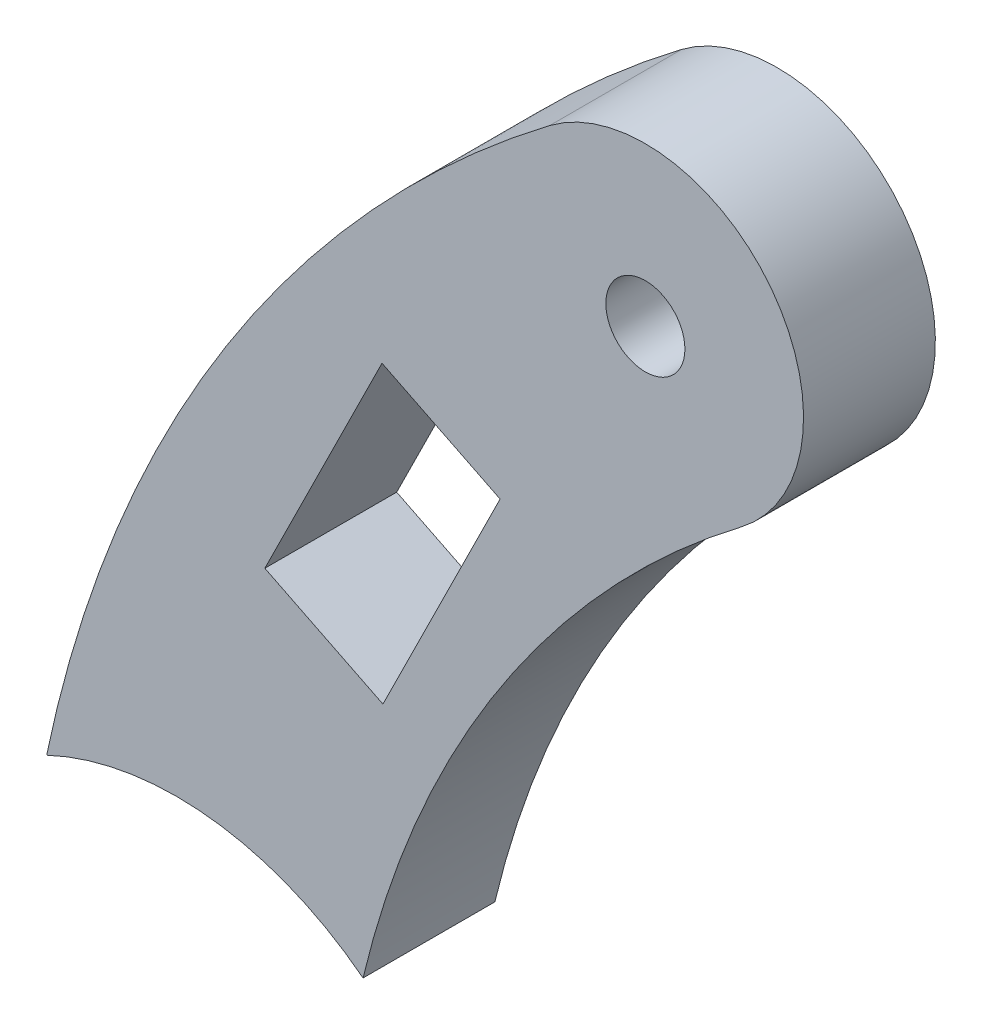
ISO-10303-21;
HEADER;
FILE_DESCRIPTION(('STEP AP214'),'2;1');
FILE_NAME('part.step','',(''),(''),'','','');
FILE_SCHEMA(('AUTOMOTIVE_DESIGN { 1 0 10303 214 1 1 1 1 }'));
ENDSEC;
DATA;
#1=APPLICATION_CONTEXT('core data for automotive mechanical design processes');
#2=APPLICATION_PROTOCOL_DEFINITION('international standard','automotive_design',2000,#1);
#3=PRODUCT_CONTEXT('',#1,'mechanical');
#4=PRODUCT('Part','Part','',(#3));
#5=PRODUCT_RELATED_PRODUCT_CATEGORY('part','',(#4));
#6=PRODUCT_DEFINITION_FORMATION('','',#4);
#7=PRODUCT_DEFINITION_CONTEXT('part definition',#1,'design');
#8=PRODUCT_DEFINITION('design','',#6,#7);
#9=PRODUCT_DEFINITION_SHAPE('','',#8);
#10=(LENGTH_UNIT() NAMED_UNIT(*) SI_UNIT(.MILLI.,.METRE.));
#11=(NAMED_UNIT(*) PLANE_ANGLE_UNIT() SI_UNIT($,.RADIAN.));
#12=(NAMED_UNIT(*) SI_UNIT($,.STERADIAN.) SOLID_ANGLE_UNIT());
#13=UNCERTAINTY_MEASURE_WITH_UNIT(LENGTH_MEASURE(1.E-05),#10,'distance_accuracy_value','');
#14=(GEOMETRIC_REPRESENTATION_CONTEXT(3) GLOBAL_UNCERTAINTY_ASSIGNED_CONTEXT((#13)) GLOBAL_UNIT_ASSIGNED_CONTEXT((#10,
#11,#12)) REPRESENTATION_CONTEXT('',''));
#15=CARTESIAN_POINT('',(0.,0.,0.));
#16=DIRECTION('',(0.,0.,1.));
#17=DIRECTION('',(1.,0.,0.));
#18=AXIS2_PLACEMENT_3D('',#15,#16,#17);
#19=CARTESIAN_POINT('',(-13.6111111111111,17.9161283295523,5.));
#20=DIRECTION('',(0.,0.,1.));
#21=DIRECTION('',(1.,0.,0.));
#22=AXIS2_PLACEMENT_3D('',#19,#20,#21);
#23=PLANE('',#22);
#24=CARTESIAN_POINT('',(-27.2222222222222,35.8322566591047,5.));
#25=DIRECTION('',(0.,0.,1.));
#26=DIRECTION('',(1.,0.,0.));
#27=AXIS2_PLACEMENT_3D('',#24,#25,#26);
#28=CIRCLE('',#27,1.5);
#29=CARTESIAN_POINT('',(-25.7222222222222,35.8322566591047,5.));
#30=VERTEX_POINT('',#29);
#31=EDGE_CURVE('E133',#30,#30,#28,.T.);
#32=ORIENTED_EDGE('',*,*,#31,.F.);
#33=EDGE_LOOP('',(#32));
#34=FACE_BOUND('',#33,.T.);
#35=CARTESIAN_POINT('',(-27.2222222222222,35.8322566591047,5.));
#36=DIRECTION('',(0.,0.,1.));
#37=DIRECTION('',(1.,0.,0.));
#38=AXIS2_PLACEMENT_3D('',#35,#36,#37);
#39=CIRCLE('',#38,6.00000000000001);
#40=CARTESIAN_POINT('',(-23.5925925925926,31.0546224378907,5.));
#41=VERTEX_POINT('',#40);
#42=CARTESIAN_POINT('',(-30.8518518518518,40.6098908803187,5.));
#43=VERTEX_POINT('',#42);
#44=EDGE_CURVE('E139',#41,#43,#39,.T.);
#45=ORIENTED_EDGE('',*,*,#44,.T.);
#46=CARTESIAN_POINT('',(0.,0.,5.));
#47=DIRECTION('',(0.,0.,1.));
#48=DIRECTION('',(1.,0.,0.));
#49=AXIS2_PLACEMENT_3D('',#46,#47,#48);
#50=CIRCLE('',#49,51.);
#51=CARTESIAN_POINT('',(-49.9305555555556,10.3893994972559,5.));
#52=VERTEX_POINT('',#51);
#53=EDGE_CURVE('E142',#43,#52,#50,.T.);
#54=ORIENTED_EDGE('',*,*,#53,.T.);
#55=CARTESIAN_POINT('',(-45.,-2.65412691824451E-13,5.));
#56=DIRECTION('',(0.,0.,-1.));
#57=DIRECTION('',(-1.,0.,0.));
#58=AXIS2_PLACEMENT_3D('',#55,#56,#57);
#59=CIRCLE('',#58,11.5000000000002);
#60=CARTESIAN_POINT('',(-37.9305555555556,9.0704440490482,5.));
#61=VERTEX_POINT('',#60);
#62=EDGE_CURVE('E145',#52,#61,#59,.T.);
#63=ORIENTED_EDGE('',*,*,#62,.T.);
#64=CARTESIAN_POINT('',(0.,0.,5.));
#65=DIRECTION('',(0.,0.,-1.));
#66=DIRECTION('',(1.,0.,0.));
#67=AXIS2_PLACEMENT_3D('',#64,#65,#66);
#68=CIRCLE('',#67,39.);
#69=EDGE_CURVE('E147',#61,#41,#68,.T.);
#70=ORIENTED_EDGE('',*,*,#69,.T.);
#71=EDGE_LOOP('',(#45,#54,#63,#70));
#72=FACE_BOUND('',#71,.T.);
#73=DIRECTION('',(0.895806416477616,-0.444444444444445,0.));
#74=VECTOR('',#73,1.);
#75=CARTESIAN_POINT('',(-41.6549983662092,20.6666666666667,5.));
#76=LINE('',#75,#74);
#77=CARTESIAN_POINT('',(-41.6549983662092,20.6666666666667,5.));
#78=VERTEX_POINT('',#77);
#79=CARTESIAN_POINT('',(-37.1759662838211,18.4444444444444,5.));
#80=VERTEX_POINT('',#79);
#81=EDGE_CURVE('E105',#78,#80,#76,.T.);
#82=ORIENTED_EDGE('',*,*,#81,.F.);
#83=DIRECTION('',(-0.444444444444446,-0.895806416477616,0.));
#84=VECTOR('',#83,1.);
#85=CARTESIAN_POINT('',(-37.2105539217647,29.6247308314428,5.));
#86=LINE('',#85,#84);
#87=CARTESIAN_POINT('',(-37.2105539217647,29.6247308314428,5.));
#88=VERTEX_POINT('',#87);
#89=EDGE_CURVE('E97',#88,#78,#86,.T.);
#90=ORIENTED_EDGE('',*,*,#89,.F.);
#91=DIRECTION('',(-0.895806416477616,0.444444444444446,0.));
#92=VECTOR('',#91,1.);
#93=CARTESIAN_POINT('',(-32.7315218393766,27.4025086092206,5.));
#94=LINE('',#93,#92);
#95=CARTESIAN_POINT('',(-32.7315218393766,27.4025086092206,5.));
#96=VERTEX_POINT('',#95);
#97=EDGE_CURVE('E119',#96,#88,#94,.T.);
#98=ORIENTED_EDGE('',*,*,#97,.F.);
#99=DIRECTION('',(0.444444444444444,0.895806416477617,0.));
#100=VECTOR('',#99,1.);
#101=CARTESIAN_POINT('',(-37.1759662838211,18.4444444444444,5.));
#102=LINE('',#101,#100);
#103=EDGE_CURVE('E117',#80,#96,#102,.T.);
#104=ORIENTED_EDGE('',*,*,#103,.F.);
#105=EDGE_LOOP('',(#82,#90,#98,#104));
#106=FACE_BOUND('',#105,.T.);
#107=ADVANCED_FACE('F32',(#34,#72,#106),#23,.T.);
#108=CARTESIAN_POINT('',(-13.6111111111111,17.9161283295523,0.));
#109=DIRECTION('',(0.,0.,1.));
#110=DIRECTION('',(1.,0.,0.));
#111=AXIS2_PLACEMENT_3D('',#108,#109,#110);
#112=PLANE('',#111);
#113=CARTESIAN_POINT('',(-27.2222222222222,35.8322566591047,0.));
#114=DIRECTION('',(0.,0.,1.));
#115=DIRECTION('',(1.,0.,0.));
#116=AXIS2_PLACEMENT_3D('',#113,#114,#115);
#117=CIRCLE('',#116,1.5);
#118=CARTESIAN_POINT('',(-25.7222222222222,35.8322566591047,0.));
#119=VERTEX_POINT('',#118);
#120=EDGE_CURVE('E113',#119,#119,#117,.T.);
#121=ORIENTED_EDGE('',*,*,#120,.T.);
#122=EDGE_LOOP('',(#121));
#123=FACE_BOUND('',#122,.T.);
#124=CARTESIAN_POINT('',(-27.2222222222222,35.8322566591047,0.));
#125=DIRECTION('',(0.,0.,1.));
#126=DIRECTION('',(1.,0.,0.));
#127=AXIS2_PLACEMENT_3D('',#124,#125,#126);
#128=CIRCLE('',#127,6.00000000000001);
#129=CARTESIAN_POINT('',(-23.5925925925926,31.0546224378907,0.));
#130=VERTEX_POINT('',#129);
#131=CARTESIAN_POINT('',(-30.8518518518518,40.6098908803187,0.));
#132=VERTEX_POINT('',#131);
#133=EDGE_CURVE('E136',#130,#132,#128,.T.);
#134=ORIENTED_EDGE('',*,*,#133,.F.);
#135=CARTESIAN_POINT('',(0.,0.,0.));
#136=DIRECTION('',(0.,0.,-1.));
#137=DIRECTION('',(1.,0.,0.));
#138=AXIS2_PLACEMENT_3D('',#135,#136,#137);
#139=CIRCLE('',#138,39.);
#140=CARTESIAN_POINT('',(-37.9305555555556,9.0704440490482,0.));
#141=VERTEX_POINT('',#140);
#142=EDGE_CURVE('E143',#141,#130,#139,.T.);
#143=ORIENTED_EDGE('',*,*,#142,.F.);
#144=CARTESIAN_POINT('',(-45.,-2.65412691824451E-13,0.));
#145=DIRECTION('',(0.,0.,-1.));
#146=DIRECTION('',(-1.,0.,0.));
#147=AXIS2_PLACEMENT_3D('',#144,#145,#146);
#148=CIRCLE('',#147,11.5000000000002);
#149=CARTESIAN_POINT('',(-49.9305555555556,10.3893994972559,0.));
#150=VERTEX_POINT('',#149);
#151=EDGE_CURVE('E154',#150,#141,#148,.T.);
#152=ORIENTED_EDGE('',*,*,#151,.F.);
#153=CARTESIAN_POINT('',(0.,0.,0.));
#154=DIRECTION('',(0.,0.,1.));
#155=DIRECTION('',(1.,0.,0.));
#156=AXIS2_PLACEMENT_3D('',#153,#154,#155);
#157=CIRCLE('',#156,51.);
#158=EDGE_CURVE('E152',#132,#150,#157,.T.);
#159=ORIENTED_EDGE('',*,*,#158,.F.);
#160=EDGE_LOOP('',(#134,#143,#152,#159));
#161=FACE_BOUND('',#160,.T.);
#162=DIRECTION('',(-0.444444444444446,-0.895806416477616,0.));
#163=VECTOR('',#162,1.);
#164=CARTESIAN_POINT('',(-37.2105539217647,29.6247308314428,0.));
#165=LINE('',#164,#163);
#166=CARTESIAN_POINT('',(-37.2105539217647,29.6247308314428,0.));
#167=VERTEX_POINT('',#166);
#168=CARTESIAN_POINT('',(-41.6549983662092,20.6666666666667,0.));
#169=VERTEX_POINT('',#168);
#170=EDGE_CURVE('E55',#167,#169,#165,.T.);
#171=ORIENTED_EDGE('',*,*,#170,.T.);
#172=DIRECTION('',(0.895806416477616,-0.444444444444445,0.));
#173=VECTOR('',#172,1.);
#174=CARTESIAN_POINT('',(-41.6549983662092,20.6666666666667,0.));
#175=LINE('',#174,#173);
#176=CARTESIAN_POINT('',(-37.1759662838211,18.4444444444444,0.));
#177=VERTEX_POINT('',#176);
#178=EDGE_CURVE('E112',#169,#177,#175,.T.);
#179=ORIENTED_EDGE('',*,*,#178,.T.);
#180=DIRECTION('',(0.444444444444444,0.895806416477617,0.));
#181=VECTOR('',#180,1.);
#182=CARTESIAN_POINT('',(-37.1759662838211,18.4444444444444,0.));
#183=LINE('',#182,#181);
#184=CARTESIAN_POINT('',(-32.7315218393766,27.4025086092206,0.));
#185=VERTEX_POINT('',#184);
#186=EDGE_CURVE('E125',#177,#185,#183,.T.);
#187=ORIENTED_EDGE('',*,*,#186,.T.);
#188=DIRECTION('',(-0.895806416477616,0.444444444444446,0.));
#189=VECTOR('',#188,1.);
#190=CARTESIAN_POINT('',(-32.7315218393766,27.4025086092206,0.));
#191=LINE('',#190,#189);
#192=EDGE_CURVE('E106',#185,#167,#191,.T.);
#193=ORIENTED_EDGE('',*,*,#192,.T.);
#194=EDGE_LOOP('',(#171,#179,#187,#193));
#195=FACE_BOUND('',#194,.T.);
#196=ADVANCED_FACE('F172',(#123,#161,#195),#112,.F.);
#197=CARTESIAN_POINT('',(-27.2222222222222,35.8322566591047,5.));
#198=DIRECTION('',(0.,0.,-1.));
#199=DIRECTION('',(-1.,0.,0.));
#200=AXIS2_PLACEMENT_3D('',#197,#198,#199);
#201=CYLINDRICAL_SURFACE('',#200,6.00000000000001);
#202=ORIENTED_EDGE('',*,*,#133,.T.);
#203=DIRECTION('',(0.,0.,-1.));
#204=VECTOR('',#203,1.);
#205=CARTESIAN_POINT('',(-30.8518518518518,40.6098908803187,5.));
#206=LINE('',#205,#204);
#207=EDGE_CURVE('E11',#43,#132,#206,.T.);
#208=ORIENTED_EDGE('',*,*,#207,.F.);
#209=ORIENTED_EDGE('',*,*,#44,.F.);
#210=DIRECTION('',(0.,0.,-1.));
#211=VECTOR('',#210,1.);
#212=CARTESIAN_POINT('',(-23.5925925925926,31.0546224378907,5.));
#213=LINE('',#212,#211);
#214=EDGE_CURVE('E149',#41,#130,#213,.T.);
#215=ORIENTED_EDGE('',*,*,#214,.T.);
#216=EDGE_LOOP('',(#202,#208,#209,#215));
#217=FACE_BOUND('',#216,.T.);
#218=ADVANCED_FACE('F34',(#217),#201,.T.);
#219=CARTESIAN_POINT('',(0.,0.,5.));
#220=DIRECTION('',(0.,0.,-1.));
#221=DIRECTION('',(-1.,0.,0.));
#222=AXIS2_PLACEMENT_3D('',#219,#220,#221);
#223=CYLINDRICAL_SURFACE('',#222,51.);
#224=ORIENTED_EDGE('',*,*,#158,.T.);
#225=DIRECTION('',(0.,0.,-1.));
#226=VECTOR('',#225,1.);
#227=CARTESIAN_POINT('',(-49.9305555555556,10.3893994972559,5.));
#228=LINE('',#227,#226);
#229=EDGE_CURVE('E40',#52,#150,#228,.T.);
#230=ORIENTED_EDGE('',*,*,#229,.F.);
#231=ORIENTED_EDGE('',*,*,#53,.F.);
#232=ORIENTED_EDGE('',*,*,#207,.T.);
#233=EDGE_LOOP('',(#224,#230,#231,#232));
#234=FACE_BOUND('',#233,.T.);
#235=ADVANCED_FACE('F182',(#234),#223,.T.);
#236=CARTESIAN_POINT('',(-45.,-2.65412691824451E-13,5.));
#237=DIRECTION('',(0.,0.,-1.));
#238=DIRECTION('',(-1.,0.,0.));
#239=AXIS2_PLACEMENT_3D('',#236,#237,#238);
#240=CYLINDRICAL_SURFACE('',#239,11.5000000000002);
#241=ORIENTED_EDGE('',*,*,#151,.T.);
#242=DIRECTION('',(0.,0.,-1.));
#243=VECTOR('',#242,1.);
#244=CARTESIAN_POINT('',(-37.9305555555556,9.0704440490482,5.));
#245=LINE('',#244,#243);
#246=EDGE_CURVE('E159',#61,#141,#245,.T.);
#247=ORIENTED_EDGE('',*,*,#246,.F.);
#248=ORIENTED_EDGE('',*,*,#62,.F.);
#249=ORIENTED_EDGE('',*,*,#229,.T.);
#250=EDGE_LOOP('',(#241,#247,#248,#249));
#251=FACE_BOUND('',#250,.T.);
#252=ADVANCED_FACE('F166',(#251),#240,.F.);
#253=CARTESIAN_POINT('',(0.,0.,5.));
#254=DIRECTION('',(0.,0.,-1.));
#255=DIRECTION('',(-1.,0.,0.));
#256=AXIS2_PLACEMENT_3D('',#253,#254,#255);
#257=CYLINDRICAL_SURFACE('',#256,39.);
#258=ORIENTED_EDGE('',*,*,#142,.T.);
#259=ORIENTED_EDGE('',*,*,#214,.F.);
#260=ORIENTED_EDGE('',*,*,#69,.F.);
#261=ORIENTED_EDGE('',*,*,#246,.T.);
#262=EDGE_LOOP('',(#258,#259,#260,#261));
#263=FACE_BOUND('',#262,.T.);
#264=ADVANCED_FACE('F176',(#263),#257,.F.);
#265=CARTESIAN_POINT('',(-27.2222222222222,35.8322566591047,5.));
#266=DIRECTION('',(0.,0.,-1.));
#267=DIRECTION('',(-1.,0.,0.));
#268=AXIS2_PLACEMENT_3D('',#265,#266,#267);
#269=CYLINDRICAL_SURFACE('',#268,1.5);
#270=ORIENTED_EDGE('',*,*,#31,.T.);
#271=EDGE_LOOP('',(#270));
#272=FACE_BOUND('',#271,.T.);
#273=ORIENTED_EDGE('',*,*,#120,.F.);
#274=EDGE_LOOP('',(#273));
#275=FACE_BOUND('',#274,.T.);
#276=ADVANCED_FACE('F199',(#272,#275),#269,.F.);
#277=CARTESIAN_POINT('',(-37.2105539217647,29.6247308314428,5.));
#278=DIRECTION('',(0.895806416477616,-0.444444444444446,0.));
#279=DIRECTION('',(0.444444444444446,0.895806416477616,0.));
#280=AXIS2_PLACEMENT_3D('',#277,#278,#279);
#281=PLANE('',#280);
#282=ORIENTED_EDGE('',*,*,#170,.F.);
#283=DIRECTION('',(0.,0.,-1.));
#284=VECTOR('',#283,1.);
#285=CARTESIAN_POINT('',(-37.2105539217647,29.6247308314428,5.));
#286=LINE('',#285,#284);
#287=EDGE_CURVE('E101',#88,#167,#286,.T.);
#288=ORIENTED_EDGE('',*,*,#287,.F.);
#289=ORIENTED_EDGE('',*,*,#89,.T.);
#290=DIRECTION('',(0.,0.,-1.));
#291=VECTOR('',#290,1.);
#292=CARTESIAN_POINT('',(-41.6549983662092,20.6666666666667,5.));
#293=LINE('',#292,#291);
#294=EDGE_CURVE('E100',#78,#169,#293,.T.);
#295=ORIENTED_EDGE('',*,*,#294,.T.);
#296=EDGE_LOOP('',(#282,#288,#289,#295));
#297=FACE_BOUND('',#296,.T.);
#298=ADVANCED_FACE('F99',(#297),#281,.T.);
#299=CARTESIAN_POINT('',(-41.6549983662092,20.6666666666667,5.));
#300=DIRECTION('',(0.444444444444445,0.895806416477616,0.));
#301=DIRECTION('',(-0.895806416477616,0.444444444444445,0.));
#302=AXIS2_PLACEMENT_3D('',#299,#300,#301);
#303=PLANE('',#302);
#304=ORIENTED_EDGE('',*,*,#178,.F.);
#305=ORIENTED_EDGE('',*,*,#294,.F.);
#306=ORIENTED_EDGE('',*,*,#81,.T.);
#307=DIRECTION('',(0.,0.,-1.));
#308=VECTOR('',#307,1.);
#309=CARTESIAN_POINT('',(-37.1759662838211,18.4444444444444,5.));
#310=LINE('',#309,#308);
#311=EDGE_CURVE('E114',#80,#177,#310,.T.);
#312=ORIENTED_EDGE('',*,*,#311,.T.);
#313=EDGE_LOOP('',(#304,#305,#306,#312));
#314=FACE_BOUND('',#313,.T.);
#315=ADVANCED_FACE('F109',(#314),#303,.T.);
#316=CARTESIAN_POINT('',(-37.1759662838211,18.4444444444444,5.));
#317=DIRECTION('',(-0.895806416477617,0.444444444444444,0.));
#318=DIRECTION('',(-0.444444444444444,-0.895806416477617,0.));
#319=AXIS2_PLACEMENT_3D('',#316,#317,#318);
#320=PLANE('',#319);
#321=ORIENTED_EDGE('',*,*,#186,.F.);
#322=ORIENTED_EDGE('',*,*,#311,.F.);
#323=ORIENTED_EDGE('',*,*,#103,.T.);
#324=DIRECTION('',(0.,0.,-1.));
#325=VECTOR('',#324,1.);
#326=CARTESIAN_POINT('',(-32.7315218393766,27.4025086092206,5.));
#327=LINE('',#326,#325);
#328=EDGE_CURVE('E47',#96,#185,#327,.T.);
#329=ORIENTED_EDGE('',*,*,#328,.T.);
#330=EDGE_LOOP('',(#321,#322,#323,#329));
#331=FACE_BOUND('',#330,.T.);
#332=ADVANCED_FACE('F215',(#331),#320,.T.);
#333=CARTESIAN_POINT('',(-32.7315218393766,27.4025086092206,5.));
#334=DIRECTION('',(-0.444444444444446,-0.895806416477616,0.));
#335=DIRECTION('',(0.895806416477616,-0.444444444444446,0.));
#336=AXIS2_PLACEMENT_3D('',#333,#334,#335);
#337=PLANE('',#336);
#338=ORIENTED_EDGE('',*,*,#192,.F.);
#339=ORIENTED_EDGE('',*,*,#328,.F.);
#340=ORIENTED_EDGE('',*,*,#97,.T.);
#341=ORIENTED_EDGE('',*,*,#287,.T.);
#342=EDGE_LOOP('',(#338,#339,#340,#341));
#343=FACE_BOUND('',#342,.T.);
#344=ADVANCED_FACE('F220',(#343),#337,.T.);
#345=CLOSED_SHELL('',(#107,#196,#218,#235,#252,#264,#276,#298,#315,#332,#344));
#346=MANIFOLD_SOLID_BREP('B2',#345);
#347=ADVANCED_BREP_SHAPE_REPRESENTATION('',(#18,#346),#14);
#348=SHAPE_DEFINITION_REPRESENTATION(#9,#347);
ENDSEC;
END-ISO-10303-21;
